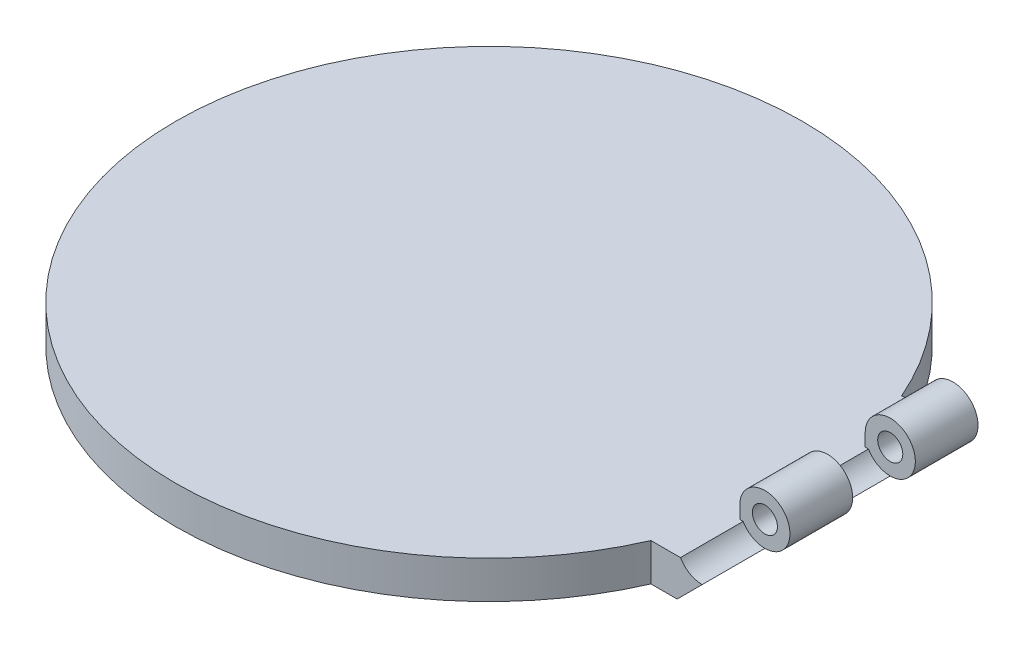
ISO-10303-21;
HEADER;
FILE_DESCRIPTION(('STEP AP214'),'2;1');
FILE_NAME('part.step','',(''),(''),'','','');
FILE_SCHEMA(('AUTOMOTIVE_DESIGN { 1 0 10303 214 1 1 1 1 }'));
ENDSEC;
DATA;
#1=APPLICATION_CONTEXT('core data for automotive mechanical design processes');
#2=APPLICATION_PROTOCOL_DEFINITION('international standard','automotive_design',2000,#1);
#3=PRODUCT_CONTEXT('',#1,'mechanical');
#4=PRODUCT('Part','Part','',(#3));
#5=PRODUCT_RELATED_PRODUCT_CATEGORY('part','',(#4));
#6=PRODUCT_DEFINITION_FORMATION('','',#4);
#7=PRODUCT_DEFINITION_CONTEXT('part definition',#1,'design');
#8=PRODUCT_DEFINITION('design','',#6,#7);
#9=PRODUCT_DEFINITION_SHAPE('','',#8);
#10=(LENGTH_UNIT() NAMED_UNIT(*) SI_UNIT(.MILLI.,.METRE.));
#11=(NAMED_UNIT(*) PLANE_ANGLE_UNIT() SI_UNIT($,.RADIAN.));
#12=(NAMED_UNIT(*) SI_UNIT($,.STERADIAN.) SOLID_ANGLE_UNIT());
#13=UNCERTAINTY_MEASURE_WITH_UNIT(LENGTH_MEASURE(1.E-05),#10,'distance_accuracy_value','');
#14=(GEOMETRIC_REPRESENTATION_CONTEXT(3) GLOBAL_UNCERTAINTY_ASSIGNED_CONTEXT((#13)) GLOBAL_UNIT_ASSIGNED_CONTEXT((#10,
#11,#12)) REPRESENTATION_CONTEXT('',''));
#15=CARTESIAN_POINT('',(0.,0.,0.));
#16=DIRECTION('',(0.,0.,1.));
#17=DIRECTION('',(1.,0.,0.));
#18=AXIS2_PLACEMENT_3D('',#15,#16,#17);
#19=CARTESIAN_POINT('',(25.,3.,-10.));
#20=DIRECTION('',(-1.,0.,0.));
#21=DIRECTION('',(0.,0.,1.));
#22=AXIS2_PLACEMENT_3D('',#19,#20,#21);
#23=PLANE('',#22);
#24=DIRECTION('',(0.,0.,-1.));
#25=VECTOR('',#24,1.);
#26=CARTESIAN_POINT('',(25.,3.,10.));
#27=LINE('',#26,#25);
#28=CARTESIAN_POINT('',(25.,3.,-5.));
#29=VERTEX_POINT('',#28);
#30=CARTESIAN_POINT('',(25.,3.,-10.));
#31=VERTEX_POINT('',#30);
#32=EDGE_CURVE('E125',#29,#31,#27,.T.);
#33=ORIENTED_EDGE('',*,*,#32,.F.);
#34=DIRECTION('',(0.,-1.,0.));
#35=VECTOR('',#34,1.);
#36=CARTESIAN_POINT('',(25.,3.,-5.));
#37=LINE('',#36,#35);
#38=CARTESIAN_POINT('',(25.,4.,-5.));
#39=VERTEX_POINT('',#38);
#40=EDGE_CURVE('E133',#39,#29,#37,.T.);
#41=ORIENTED_EDGE('',*,*,#40,.F.);
#42=DIRECTION('',(0.,0.,1.));
#43=VECTOR('',#42,1.);
#44=CARTESIAN_POINT('',(25.,4.,-10.));
#45=LINE('',#44,#43);
#46=CARTESIAN_POINT('',(25.,4.,-10.));
#47=VERTEX_POINT('',#46);
#48=EDGE_CURVE('E208',#47,#39,#45,.T.);
#49=ORIENTED_EDGE('',*,*,#48,.F.);
#50=DIRECTION('',(0.,-1.,0.));
#51=VECTOR('',#50,1.);
#52=CARTESIAN_POINT('',(25.,3.,-10.));
#53=LINE('',#52,#51);
#54=EDGE_CURVE('E143',#47,#31,#53,.T.);
#55=ORIENTED_EDGE('',*,*,#54,.T.);
#56=EDGE_LOOP('',(#33,#41,#49,#55));
#57=FACE_BOUND('',#56,.T.);
#58=ADVANCED_FACE('F36',(#57),#23,.T.);
#59=CARTESIAN_POINT('',(27.,4.,-10.));
#60=DIRECTION('',(0.,0.,1.));
#61=DIRECTION('',(1.,0.,0.));
#62=AXIS2_PLACEMENT_3D('',#59,#60,#61);
#63=CYLINDRICAL_SURFACE('',#62,2.);
#64=ORIENTED_EDGE('',*,*,#48,.T.);
#65=CARTESIAN_POINT('',(27.,4.,-5.));
#66=DIRECTION('',(0.,0.,1.));
#67=DIRECTION('',(1.,0.,0.));
#68=AXIS2_PLACEMENT_3D('',#65,#66,#67);
#69=CIRCLE('',#68,2.);
#70=CARTESIAN_POINT('',(27.,2.,-5.));
#71=VERTEX_POINT('',#70);
#72=EDGE_CURVE('E132',#71,#39,#69,.T.);
#73=ORIENTED_EDGE('',*,*,#72,.F.);
#74=DIRECTION('',(0.,0.,1.));
#75=VECTOR('',#74,1.);
#76=CARTESIAN_POINT('',(27.,2.,-10.));
#77=LINE('',#76,#75);
#78=CARTESIAN_POINT('',(27.,2.,-10.));
#79=VERTEX_POINT('',#78);
#80=EDGE_CURVE('E210',#79,#71,#77,.T.);
#81=ORIENTED_EDGE('',*,*,#80,.F.);
#82=CARTESIAN_POINT('',(27.,4.,-10.));
#83=DIRECTION('',(0.,0.,1.));
#84=DIRECTION('',(1.,0.,0.));
#85=AXIS2_PLACEMENT_3D('',#82,#83,#84);
#86=CIRCLE('',#85,2.);
#87=EDGE_CURVE('E204',#79,#47,#86,.T.);
#88=ORIENTED_EDGE('',*,*,#87,.T.);
#89=EDGE_LOOP('',(#64,#73,#81,#88));
#90=FACE_BOUND('',#89,.T.);
#91=ADVANCED_FACE('F250',(#90),#63,.T.);
#92=CARTESIAN_POINT('',(27.,4.,-12.8284271247462));
#93=DIRECTION('',(0.,0.,1.));
#94=DIRECTION('',(1.,0.,0.));
#95=AXIS2_PLACEMENT_3D('',#92,#93,#94);
#96=CYLINDRICAL_SURFACE('',#95,0.999999999999998);
#97=CARTESIAN_POINT('',(27.,4.,-10.));
#98=DIRECTION('',(0.,0.,1.));
#99=DIRECTION('',(1.,0.,0.));
#100=AXIS2_PLACEMENT_3D('',#97,#98,#99);
#101=CIRCLE('',#100,0.999999999999998);
#102=CARTESIAN_POINT('',(28.,4.,-10.));
#103=VERTEX_POINT('',#102);
#104=EDGE_CURVE('E186',#103,#103,#101,.F.);
#105=ORIENTED_EDGE('',*,*,#104,.T.);
#106=EDGE_LOOP('',(#105));
#107=FACE_BOUND('',#106,.T.);
#108=CARTESIAN_POINT('',(27.,4.,-5.));
#109=DIRECTION('',(0.,0.,1.));
#110=DIRECTION('',(1.,0.,0.));
#111=AXIS2_PLACEMENT_3D('',#108,#109,#110);
#112=CIRCLE('',#111,0.999999999999998);
#113=CARTESIAN_POINT('',(28.,4.,-5.));
#114=VERTEX_POINT('',#113);
#115=EDGE_CURVE('E234',#114,#114,#112,.F.);
#116=ORIENTED_EDGE('',*,*,#115,.F.);
#117=EDGE_LOOP('',(#116));
#118=FACE_BOUND('',#117,.T.);
#119=ADVANCED_FACE('F272',(#107,#118),#96,.F.);
#120=DIRECTION('',(0.,-1.,0.));
#121=VECTOR('',#120,1.);
#122=CARTESIAN_POINT('',(25.,3.,0.));
#123=LINE('',#122,#121);
#124=CARTESIAN_POINT('',(25.,4.,0.));
#125=VERTEX_POINT('',#124);
#126=CARTESIAN_POINT('',(25.,3.,0.));
#127=VERTEX_POINT('',#126);
#128=EDGE_CURVE('E246',#125,#127,#123,.T.);
#129=ORIENTED_EDGE('',*,*,#128,.T.);
#130=CARTESIAN_POINT('',(25.,3.,5.));
#131=VERTEX_POINT('',#130);
#132=EDGE_CURVE('E145',#131,#127,#27,.T.);
#133=ORIENTED_EDGE('',*,*,#132,.F.);
#134=DIRECTION('',(0.,-1.,0.));
#135=VECTOR('',#134,1.);
#136=CARTESIAN_POINT('',(25.,3.,5.));
#137=LINE('',#136,#135);
#138=CARTESIAN_POINT('',(25.,4.,5.));
#139=VERTEX_POINT('',#138);
#140=EDGE_CURVE('E230',#139,#131,#137,.T.);
#141=ORIENTED_EDGE('',*,*,#140,.F.);
#142=EDGE_CURVE('E209',#125,#139,#45,.T.);
#143=ORIENTED_EDGE('',*,*,#142,.F.);
#144=EDGE_LOOP('',(#129,#133,#141,#143));
#145=FACE_BOUND('',#144,.T.);
#146=ADVANCED_FACE('F268',(#145),#23,.T.);
#147=CARTESIAN_POINT('',(27.,4.,0.));
#148=DIRECTION('',(0.,0.,1.));
#149=DIRECTION('',(1.,0.,0.));
#150=AXIS2_PLACEMENT_3D('',#147,#148,#149);
#151=CIRCLE('',#150,2.);
#152=CARTESIAN_POINT('',(27.,2.,0.));
#153=VERTEX_POINT('',#152);
#154=EDGE_CURVE('E243',#153,#125,#151,.T.);
#155=ORIENTED_EDGE('',*,*,#154,.T.);
#156=ORIENTED_EDGE('',*,*,#142,.T.);
#157=CARTESIAN_POINT('',(27.,4.,5.));
#158=DIRECTION('',(0.,0.,1.));
#159=DIRECTION('',(1.,0.,0.));
#160=AXIS2_PLACEMENT_3D('',#157,#158,#159);
#161=CIRCLE('',#160,2.);
#162=CARTESIAN_POINT('',(27.,2.,5.));
#163=VERTEX_POINT('',#162);
#164=EDGE_CURVE('E187',#163,#139,#161,.T.);
#165=ORIENTED_EDGE('',*,*,#164,.F.);
#166=EDGE_CURVE('E213',#153,#163,#77,.T.);
#167=ORIENTED_EDGE('',*,*,#166,.F.);
#168=EDGE_LOOP('',(#155,#156,#165,#167));
#169=FACE_BOUND('',#168,.T.);
#170=ADVANCED_FACE('F228',(#169),#63,.T.);
#171=CARTESIAN_POINT('',(27.,4.,0.));
#172=DIRECTION('',(0.,0.,1.));
#173=DIRECTION('',(1.,0.,0.));
#174=AXIS2_PLACEMENT_3D('',#171,#172,#173);
#175=CIRCLE('',#174,0.999999999999998);
#176=CARTESIAN_POINT('',(28.,4.,0.));
#177=VERTEX_POINT('',#176);
#178=EDGE_CURVE('E237',#177,#177,#175,.F.);
#179=ORIENTED_EDGE('',*,*,#178,.T.);
#180=EDGE_LOOP('',(#179));
#181=FACE_BOUND('',#180,.T.);
#182=CARTESIAN_POINT('',(27.,4.,5.));
#183=DIRECTION('',(0.,0.,1.));
#184=DIRECTION('',(1.,0.,0.));
#185=AXIS2_PLACEMENT_3D('',#182,#183,#184);
#186=CIRCLE('',#185,0.999999999999998);
#187=CARTESIAN_POINT('',(28.,4.,5.));
#188=VERTEX_POINT('',#187);
#189=EDGE_CURVE('E40',#188,#188,#186,.F.);
#190=ORIENTED_EDGE('',*,*,#189,.F.);
#191=EDGE_LOOP('',(#190));
#192=FACE_BOUND('',#191,.T.);
#193=ADVANCED_FACE('F280',(#181,#192),#96,.F.);
#194=CARTESIAN_POINT('',(0.,3.,0.));
#195=DIRECTION('',(0.,-1.,0.));
#196=DIRECTION('',(0.,0.,-1.));
#197=AXIS2_PLACEMENT_3D('',#194,#195,#196);
#198=CYLINDRICAL_SURFACE('',#197,25.);
#199=DIRECTION('',(0.,-1.,0.));
#200=VECTOR('',#199,1.);
#201=CARTESIAN_POINT('',(22.9128784747792,3.,-10.));
#202=LINE('',#201,#200);
#203=CARTESIAN_POINT('',(22.9128784747792,3.,-10.));
#204=VERTEX_POINT('',#203);
#205=CARTESIAN_POINT('',(22.9128784747792,0.,-10.));
#206=VERTEX_POINT('',#205);
#207=EDGE_CURVE('E163',#204,#206,#202,.T.);
#208=ORIENTED_EDGE('',*,*,#207,.T.);
#209=CARTESIAN_POINT('',(0.,0.,0.));
#210=DIRECTION('',(0.,1.,0.));
#211=DIRECTION('',(0.,0.,1.));
#212=AXIS2_PLACEMENT_3D('',#209,#210,#211);
#213=CIRCLE('',#212,25.);
#214=CARTESIAN_POINT('',(22.9128784747792,0.,10.));
#215=VERTEX_POINT('',#214);
#216=EDGE_CURVE('E45',#206,#215,#213,.T.);
#217=ORIENTED_EDGE('',*,*,#216,.T.);
#218=DIRECTION('',(0.,-1.,0.));
#219=VECTOR('',#218,1.);
#220=CARTESIAN_POINT('',(22.9128784747792,3.,10.));
#221=LINE('',#220,#219);
#222=CARTESIAN_POINT('',(22.9128784747792,3.,10.));
#223=VERTEX_POINT('',#222);
#224=EDGE_CURVE('E155',#215,#223,#221,.F.);
#225=ORIENTED_EDGE('',*,*,#224,.T.);
#226=CARTESIAN_POINT('',(0.,3.,0.));
#227=DIRECTION('',(0.,1.,0.));
#228=DIRECTION('',(0.,0.,1.));
#229=AXIS2_PLACEMENT_3D('',#226,#227,#228);
#230=CIRCLE('',#229,25.);
#231=EDGE_CURVE('E11',#204,#223,#230,.T.);
#232=ORIENTED_EDGE('',*,*,#231,.F.);
#233=EDGE_LOOP('',(#208,#217,#225,#232));
#234=FACE_BOUND('',#233,.T.);
#235=ADVANCED_FACE('F38',(#234),#198,.T.);
#236=CARTESIAN_POINT('',(0.,3.,0.));
#237=DIRECTION('',(0.,1.,0.));
#238=DIRECTION('',(0.,0.,1.));
#239=AXIS2_PLACEMENT_3D('',#236,#237,#238);
#240=PLANE('',#239);
#241=DIRECTION('',(1.,0.,0.));
#242=VECTOR('',#241,1.);
#243=CARTESIAN_POINT('',(-25.001,3.,10.));
#244=LINE('',#243,#242);
#245=CARTESIAN_POINT('',(25.2679491924311,3.,10.));
#246=VERTEX_POINT('',#245);
#247=EDGE_CURVE('E146',#223,#246,#244,.T.);
#248=ORIENTED_EDGE('',*,*,#247,.T.);
#249=DIRECTION('',(0.,0.,1.));
#250=VECTOR('',#249,1.);
#251=CARTESIAN_POINT('',(25.2679491924311,3.,5.));
#252=LINE('',#251,#250);
#253=CARTESIAN_POINT('',(25.2679491924311,3.,5.));
#254=VERTEX_POINT('',#253);
#255=EDGE_CURVE('E175',#254,#246,#252,.T.);
#256=ORIENTED_EDGE('',*,*,#255,.F.);
#257=DIRECTION('',(1.,0.,0.));
#258=VECTOR('',#257,1.);
#259=CARTESIAN_POINT('',(25.,3.,5.));
#260=LINE('',#259,#258);
#261=EDGE_CURVE('E225',#131,#254,#260,.T.);
#262=ORIENTED_EDGE('',*,*,#261,.F.);
#263=ORIENTED_EDGE('',*,*,#132,.T.);
#264=DIRECTION('',(1.,0.,0.));
#265=VECTOR('',#264,1.);
#266=CARTESIAN_POINT('',(25.,3.,0.));
#267=LINE('',#266,#265);
#268=CARTESIAN_POINT('',(25.2679491924311,3.,0.));
#269=VERTEX_POINT('',#268);
#270=EDGE_CURVE('E244',#127,#269,#267,.T.);
#271=ORIENTED_EDGE('',*,*,#270,.T.);
#272=DIRECTION('',(0.,0.,1.));
#273=VECTOR('',#272,1.);
#274=CARTESIAN_POINT('',(25.2679491924311,3.,-5.));
#275=LINE('',#274,#273);
#276=CARTESIAN_POINT('',(25.2679491924311,3.,-5.));
#277=VERTEX_POINT('',#276);
#278=EDGE_CURVE('E128',#277,#269,#275,.T.);
#279=ORIENTED_EDGE('',*,*,#278,.F.);
#280=DIRECTION('',(1.,0.,0.));
#281=VECTOR('',#280,1.);
#282=CARTESIAN_POINT('',(25.,3.,-5.));
#283=LINE('',#282,#281);
#284=EDGE_CURVE('E121',#29,#277,#283,.T.);
#285=ORIENTED_EDGE('',*,*,#284,.F.);
#286=ORIENTED_EDGE('',*,*,#32,.T.);
#287=DIRECTION('',(1.,0.,0.));
#288=VECTOR('',#287,1.);
#289=CARTESIAN_POINT('',(-25.001,3.,-10.));
#290=LINE('',#289,#288);
#291=EDGE_CURVE('E193',#204,#31,#290,.T.);
#292=ORIENTED_EDGE('',*,*,#291,.F.);
#293=ORIENTED_EDGE('',*,*,#231,.T.);
#294=EDGE_LOOP('',(#248,#256,#262,#263,#271,#279,#285,#286,#292,#293));
#295=FACE_BOUND('',#294,.T.);
#296=ADVANCED_FACE('F123',(#295),#240,.T.);
#297=CARTESIAN_POINT('',(0.,0.,0.));
#298=DIRECTION('',(0.,1.,0.));
#299=DIRECTION('',(0.,0.,1.));
#300=AXIS2_PLACEMENT_3D('',#297,#298,#299);
#301=PLANE('',#300);
#302=ORIENTED_EDGE('',*,*,#216,.F.);
#303=DIRECTION('',(1.,0.,0.));
#304=VECTOR('',#303,1.);
#305=CARTESIAN_POINT('',(-25.001,0.,-10.));
#306=LINE('',#305,#304);
#307=CARTESIAN_POINT('',(25.,0.,-10.));
#308=VERTEX_POINT('',#307);
#309=EDGE_CURVE('E195',#206,#308,#306,.T.);
#310=ORIENTED_EDGE('',*,*,#309,.T.);
#311=DIRECTION('',(0.,0.,1.));
#312=VECTOR('',#311,1.);
#313=CARTESIAN_POINT('',(25.,0.,10.));
#314=LINE('',#313,#312);
#315=CARTESIAN_POINT('',(25.,0.,10.));
#316=VERTEX_POINT('',#315);
#317=EDGE_CURVE('E150',#308,#316,#314,.T.);
#318=ORIENTED_EDGE('',*,*,#317,.T.);
#319=DIRECTION('',(1.,0.,0.));
#320=VECTOR('',#319,1.);
#321=CARTESIAN_POINT('',(-25.001,0.,10.));
#322=LINE('',#321,#320);
#323=EDGE_CURVE('E149',#215,#316,#322,.T.);
#324=ORIENTED_EDGE('',*,*,#323,.F.);
#325=EDGE_LOOP('',(#302,#310,#318,#324));
#326=FACE_BOUND('',#325,.T.);
#327=ADVANCED_FACE('F168',(#326),#301,.F.);
#328=CARTESIAN_POINT('',(-25.001,0.,10.));
#329=DIRECTION('',(0.,0.,-1.));
#330=DIRECTION('',(-1.,0.,0.));
#331=AXIS2_PLACEMENT_3D('',#328,#329,#330);
#332=PLANE('',#331);
#333=DIRECTION('',(0.707106781186548,0.707106781186547,0.));
#334=VECTOR('',#333,1.);
#335=CARTESIAN_POINT('',(25.,0.,10.));
#336=LINE('',#335,#334);
#337=CARTESIAN_POINT('',(27.,2.,10.));
#338=VERTEX_POINT('',#337);
#339=EDGE_CURVE('E197',#316,#338,#336,.T.);
#340=ORIENTED_EDGE('',*,*,#339,.T.);
#341=CARTESIAN_POINT('',(27.,4.,10.));
#342=DIRECTION('',(0.,0.,1.));
#343=DIRECTION('',(1.,0.,0.));
#344=AXIS2_PLACEMENT_3D('',#341,#342,#343);
#345=CIRCLE('',#344,2.);
#346=EDGE_CURVE('E173',#246,#338,#345,.T.);
#347=ORIENTED_EDGE('',*,*,#346,.F.);
#348=ORIENTED_EDGE('',*,*,#247,.F.);
#349=ORIENTED_EDGE('',*,*,#224,.F.);
#350=ORIENTED_EDGE('',*,*,#323,.T.);
#351=EDGE_LOOP('',(#340,#347,#348,#349,#350));
#352=FACE_BOUND('',#351,.T.);
#353=ADVANCED_FACE('F171',(#352),#332,.F.);
#354=CARTESIAN_POINT('',(25.,0.,-10.));
#355=DIRECTION('',(0.707106781186547,-0.707106781186548,0.));
#356=DIRECTION('',(0.707106781186548,0.707106781186547,0.));
#357=AXIS2_PLACEMENT_3D('',#354,#355,#356);
#358=PLANE('',#357);
#359=ORIENTED_EDGE('',*,*,#80,.T.);
#360=EDGE_CURVE('E212',#71,#153,#77,.T.);
#361=ORIENTED_EDGE('',*,*,#360,.T.);
#362=ORIENTED_EDGE('',*,*,#166,.T.);
#363=EDGE_CURVE('E207',#163,#338,#77,.T.);
#364=ORIENTED_EDGE('',*,*,#363,.T.);
#365=ORIENTED_EDGE('',*,*,#339,.F.);
#366=ORIENTED_EDGE('',*,*,#317,.F.);
#367=DIRECTION('',(0.707106781186548,0.707106781186547,0.));
#368=VECTOR('',#367,1.);
#369=CARTESIAN_POINT('',(25.,0.,-10.));
#370=LINE('',#369,#368);
#371=EDGE_CURVE('E201',#308,#79,#370,.T.);
#372=ORIENTED_EDGE('',*,*,#371,.T.);
#373=EDGE_LOOP('',(#359,#361,#362,#364,#365,#366,#372));
#374=FACE_BOUND('',#373,.T.);
#375=ADVANCED_FACE('F216',(#374),#358,.T.);
#376=CARTESIAN_POINT('',(27.,4.,-10.));
#377=DIRECTION('',(0.,0.,1.));
#378=DIRECTION('',(1.,0.,0.));
#379=AXIS2_PLACEMENT_3D('',#376,#377,#378);
#380=PLANE('',#379);
#381=ORIENTED_EDGE('',*,*,#104,.F.);
#382=EDGE_LOOP('',(#381));
#383=FACE_BOUND('',#382,.T.);
#384=ORIENTED_EDGE('',*,*,#54,.F.);
#385=ORIENTED_EDGE('',*,*,#87,.F.);
#386=ORIENTED_EDGE('',*,*,#371,.F.);
#387=ORIENTED_EDGE('',*,*,#309,.F.);
#388=ORIENTED_EDGE('',*,*,#207,.F.);
#389=ORIENTED_EDGE('',*,*,#291,.T.);
#390=EDGE_LOOP('',(#384,#385,#386,#387,#388,#389));
#391=FACE_BOUND('',#390,.T.);
#392=ADVANCED_FACE('F254',(#383,#391),#380,.F.);
#393=CARTESIAN_POINT('',(27.,4.,5.));
#394=DIRECTION('',(0.,0.,1.));
#395=DIRECTION('',(1.,0.,0.));
#396=AXIS2_PLACEMENT_3D('',#393,#394,#395);
#397=PLANE('',#396);
#398=ORIENTED_EDGE('',*,*,#140,.T.);
#399=ORIENTED_EDGE('',*,*,#261,.T.);
#400=EDGE_CURVE('E183',#254,#163,#161,.T.);
#401=ORIENTED_EDGE('',*,*,#400,.T.);
#402=ORIENTED_EDGE('',*,*,#164,.T.);
#403=EDGE_LOOP('',(#398,#399,#401,#402));
#404=FACE_BOUND('',#403,.T.);
#405=ORIENTED_EDGE('',*,*,#189,.T.);
#406=EDGE_LOOP('',(#405));
#407=FACE_BOUND('',#406,.T.);
#408=ADVANCED_FACE('F222',(#404,#407),#397,.T.);
#409=CARTESIAN_POINT('',(27.,4.,5.));
#410=DIRECTION('',(0.,0.,1.));
#411=DIRECTION('',(1.,0.,0.));
#412=AXIS2_PLACEMENT_3D('',#409,#410,#411);
#413=CYLINDRICAL_SURFACE('',#412,2.);
#414=ORIENTED_EDGE('',*,*,#363,.F.);
#415=ORIENTED_EDGE('',*,*,#400,.F.);
#416=ORIENTED_EDGE('',*,*,#255,.T.);
#417=ORIENTED_EDGE('',*,*,#346,.T.);
#418=EDGE_LOOP('',(#414,#415,#416,#417));
#419=FACE_BOUND('',#418,.T.);
#420=ADVANCED_FACE('F180',(#419),#413,.F.);
#421=CARTESIAN_POINT('',(27.,4.,-5.));
#422=DIRECTION('',(0.,0.,1.));
#423=DIRECTION('',(1.,0.,0.));
#424=AXIS2_PLACEMENT_3D('',#421,#422,#423);
#425=PLANE('',#424);
#426=ORIENTED_EDGE('',*,*,#40,.T.);
#427=ORIENTED_EDGE('',*,*,#284,.T.);
#428=EDGE_CURVE('E241',#277,#71,#69,.T.);
#429=ORIENTED_EDGE('',*,*,#428,.T.);
#430=ORIENTED_EDGE('',*,*,#72,.T.);
#431=EDGE_LOOP('',(#426,#427,#429,#430));
#432=FACE_BOUND('',#431,.T.);
#433=ORIENTED_EDGE('',*,*,#115,.T.);
#434=EDGE_LOOP('',(#433));
#435=FACE_BOUND('',#434,.T.);
#436=ADVANCED_FACE('F136',(#432,#435),#425,.T.);
#437=CARTESIAN_POINT('',(27.,4.,0.));
#438=DIRECTION('',(0.,0.,1.));
#439=DIRECTION('',(1.,0.,0.));
#440=AXIS2_PLACEMENT_3D('',#437,#438,#439);
#441=PLANE('',#440);
#442=ORIENTED_EDGE('',*,*,#128,.F.);
#443=ORIENTED_EDGE('',*,*,#154,.F.);
#444=EDGE_CURVE('E53',#269,#153,#151,.T.);
#445=ORIENTED_EDGE('',*,*,#444,.F.);
#446=ORIENTED_EDGE('',*,*,#270,.F.);
#447=EDGE_LOOP('',(#442,#443,#445,#446));
#448=FACE_BOUND('',#447,.T.);
#449=ORIENTED_EDGE('',*,*,#178,.F.);
#450=EDGE_LOOP('',(#449));
#451=FACE_BOUND('',#450,.T.);
#452=ADVANCED_FACE('F284',(#448,#451),#441,.F.);
#453=CARTESIAN_POINT('',(27.,4.,-5.));
#454=DIRECTION('',(0.,0.,1.));
#455=DIRECTION('',(1.,0.,0.));
#456=AXIS2_PLACEMENT_3D('',#453,#454,#455);
#457=CYLINDRICAL_SURFACE('',#456,2.);
#458=ORIENTED_EDGE('',*,*,#360,.F.);
#459=ORIENTED_EDGE('',*,*,#428,.F.);
#460=ORIENTED_EDGE('',*,*,#278,.T.);
#461=ORIENTED_EDGE('',*,*,#444,.T.);
#462=EDGE_LOOP('',(#458,#459,#460,#461));
#463=FACE_BOUND('',#462,.T.);
#464=ADVANCED_FACE('F287',(#463),#457,.F.);
#465=CLOSED_SHELL('',(#58,#91,#119,#146,#170,#193,#235,#296,#327,#353,#375,#392,#408,#420,#436,
#452,#464));
#466=MANIFOLD_SOLID_BREP('B2',#465);
#467=ADVANCED_BREP_SHAPE_REPRESENTATION('',(#18,#466),#14);
#468=SHAPE_DEFINITION_REPRESENTATION(#9,#467);
ENDSEC;
END-ISO-10303-21;
